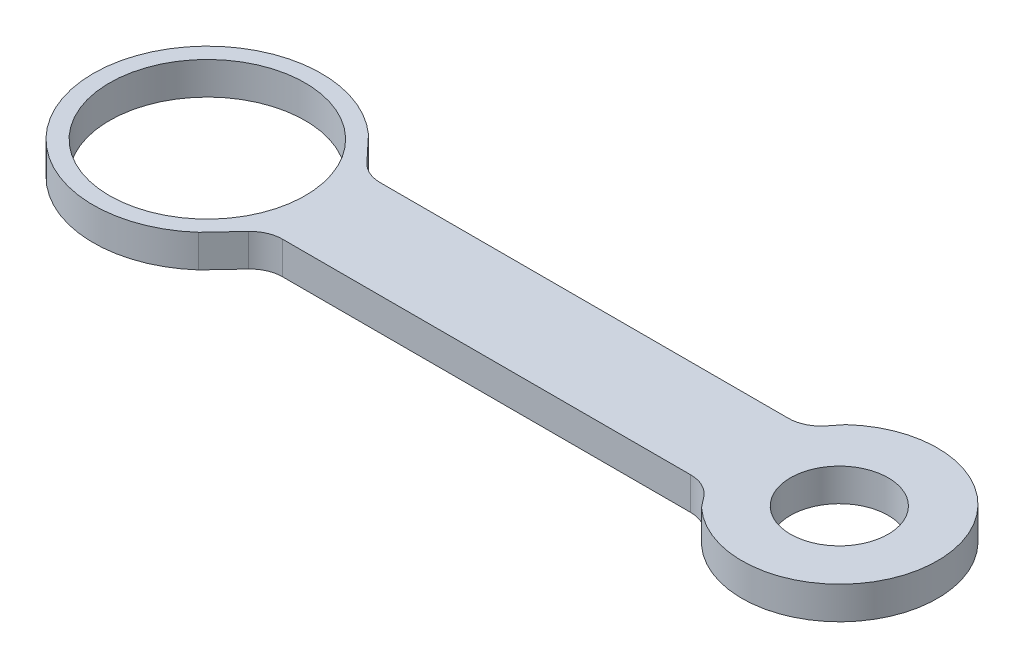
ISO-10303-21;
HEADER;
FILE_DESCRIPTION(('STEP AP214'),'2;1');
FILE_NAME('part.step','',(''),(''),'','','');
FILE_SCHEMA(('AUTOMOTIVE_DESIGN { 1 0 10303 214 1 1 1 1 }'));
ENDSEC;
DATA;
#1=APPLICATION_CONTEXT('core data for automotive mechanical design processes');
#2=APPLICATION_PROTOCOL_DEFINITION('international standard','automotive_design',2000,#1);
#3=PRODUCT_CONTEXT('',#1,'mechanical');
#4=PRODUCT('Part','Part','',(#3));
#5=PRODUCT_RELATED_PRODUCT_CATEGORY('part','',(#4));
#6=PRODUCT_DEFINITION_FORMATION('','',#4);
#7=PRODUCT_DEFINITION_CONTEXT('part definition',#1,'design');
#8=PRODUCT_DEFINITION('design','',#6,#7);
#9=PRODUCT_DEFINITION_SHAPE('','',#8);
#10=(LENGTH_UNIT() NAMED_UNIT(*) SI_UNIT(.MILLI.,.METRE.));
#11=(NAMED_UNIT(*) PLANE_ANGLE_UNIT() SI_UNIT($,.RADIAN.));
#12=(NAMED_UNIT(*) SI_UNIT($,.STERADIAN.) SOLID_ANGLE_UNIT());
#13=UNCERTAINTY_MEASURE_WITH_UNIT(LENGTH_MEASURE(1.E-05),#10,'distance_accuracy_value','');
#14=(GEOMETRIC_REPRESENTATION_CONTEXT(3) GLOBAL_UNCERTAINTY_ASSIGNED_CONTEXT((#13)) GLOBAL_UNIT_ASSIGNED_CONTEXT((#10,
#11,#12)) REPRESENTATION_CONTEXT('',''));
#15=CARTESIAN_POINT('',(0.,0.,0.));
#16=DIRECTION('',(0.,0.,1.));
#17=DIRECTION('',(1.,0.,0.));
#18=AXIS2_PLACEMENT_3D('',#15,#16,#17);
#19=CARTESIAN_POINT('',(34.5542588042572,10.,29.2896186462432));
#20=DIRECTION('',(0.,1.,0.));
#21=DIRECTION('',(0.,0.,1.));
#22=AXIS2_PLACEMENT_3D('',#19,#20,#21);
#23=PLANE('',#22);
#24=CARTESIAN_POINT('',(-128.685528506925,10.,4.28961864624316));
#25=DIRECTION('',(0.,1.,0.));
#26=DIRECTION('',(0.,0.,1.));
#27=AXIS2_PLACEMENT_3D('',#24,#25,#26);
#28=CIRCLE('',#27,30.);
#29=CARTESIAN_POINT('',(-128.685528506925,10.,34.2896186462432));
#30=VERTEX_POINT('',#29);
#31=EDGE_CURVE('E313',#30,#30,#28,.T.);
#32=ORIENTED_EDGE('',*,*,#31,.F.);
#33=EDGE_LOOP('',(#32));
#34=FACE_BOUND('',#33,.T.);
#35=CARTESIAN_POINT('',(65.6642007032262,10.,4.77304690580662));
#36=DIRECTION('',(0.,1.,0.));
#37=DIRECTION('',(0.,0.,1.));
#38=AXIS2_PLACEMENT_3D('',#35,#36,#37);
#39=CIRCLE('',#38,15.);
#40=CARTESIAN_POINT('',(65.6642007032262,10.,19.7730469058066));
#41=VERTEX_POINT('',#40);
#42=EDGE_CURVE('E321',#41,#41,#39,.T.);
#43=ORIENTED_EDGE('',*,*,#42,.F.);
#44=EDGE_LOOP('',(#43));
#45=FACE_BOUND('',#44,.T.);
#46=CARTESIAN_POINT('',(34.5542588042572,10.,29.2896186462432));
#47=DIRECTION('',(0.,-1.,0.));
#48=DIRECTION('',(0.,0.,1.));
#49=AXIS2_PLACEMENT_3D('',#46,#47,#48);
#50=CIRCLE('',#49,10.);
#51=CARTESIAN_POINT('',(34.5542588042572,10.,19.2896186462432));
#52=VERTEX_POINT('',#51);
#53=CARTESIAN_POINT('',(42.3953887831997,10.,23.0834378034599));
#54=VERTEX_POINT('',#53);
#55=EDGE_CURVE('E199',#52,#54,#50,.T.);
#56=ORIENTED_EDGE('',*,*,#55,.T.);
#57=DIRECTION('',(0.620618084278327,0.,0.784112997894244));
#58=VECTOR('',#57,1.);
#59=CARTESIAN_POINT('',(42.3953887831997,10.,23.0834378034599));
#60=LINE('',#59,#58);
#61=CARTESIAN_POINT('',(45.0141879093079,10.,26.3921303563741));
#62=VERTEX_POINT('',#61);
#63=EDGE_CURVE('E112',#54,#62,#60,.T.);
#64=ORIENTED_EDGE('',*,*,#63,.T.);
#65=CARTESIAN_POINT('',(65.2991324767334,10.,4.28961864624317));
#66=DIRECTION('',(0.,1.,0.));
#67=DIRECTION('',(0.,0.,1.));
#68=AXIS2_PLACEMENT_3D('',#65,#66,#67);
#69=CIRCLE('',#68,30.);
#70=CARTESIAN_POINT('',(45.0141879093079,10.,-17.8128930638877));
#71=VERTEX_POINT('',#70);
#72=EDGE_CURVE('E236',#62,#71,#69,.T.);
#73=ORIENTED_EDGE('',*,*,#72,.T.);
#74=DIRECTION('',(-0.620618084278327,0.,0.784112997894244));
#75=VECTOR('',#74,1.);
#76=CARTESIAN_POINT('',(42.3953887831997,10.,-14.5042005109736));
#77=LINE('',#76,#75);
#78=CARTESIAN_POINT('',(42.3953887831997,10.,-14.5042005109736));
#79=VERTEX_POINT('',#78);
#80=EDGE_CURVE('E255',#71,#79,#77,.T.);
#81=ORIENTED_EDGE('',*,*,#80,.T.);
#82=CARTESIAN_POINT('',(34.5542588042572,10.,-20.7103813537568));
#83=DIRECTION('',(0.,-1.,0.));
#84=DIRECTION('',(0.,0.,-1.));
#85=AXIS2_PLACEMENT_3D('',#82,#83,#84);
#86=CIRCLE('',#85,10.);
#87=CARTESIAN_POINT('',(34.5542588042572,10.,-10.7103813537568));
#88=VERTEX_POINT('',#87);
#89=EDGE_CURVE('E251',#79,#88,#86,.T.);
#90=ORIENTED_EDGE('',*,*,#89,.T.);
#91=DIRECTION('',(-1.,0.,0.));
#92=VECTOR('',#91,1.);
#93=CARTESIAN_POINT('',(-90.6073835006081,10.,-10.7103813537568));
#94=LINE('',#93,#92);
#95=CARTESIAN_POINT('',(-90.6073835006081,10.,-10.7103813537568));
#96=VERTEX_POINT('',#95);
#97=EDGE_CURVE('E254',#88,#96,#94,.T.);
#98=ORIENTED_EDGE('',*,*,#97,.T.);
#99=CARTESIAN_POINT('',(-90.6073835006081,10.,-20.7103813537568));
#100=DIRECTION('',(0.,-1.,0.));
#101=DIRECTION('',(0.,0.,-1.));
#102=AXIS2_PLACEMENT_3D('',#99,#100,#101);
#103=CIRCLE('',#102,10.);
#104=CARTESIAN_POINT('',(-97.8975448968442,10.,-13.8654162832229));
#105=VERTEX_POINT('',#104);
#106=EDGE_CURVE('E259',#96,#105,#103,.T.);
#107=ORIENTED_EDGE('',*,*,#106,.T.);
#108=DIRECTION('',(-0.684496507053392,0.,-0.729016139623606));
#109=VECTOR('',#108,1.);
#110=CARTESIAN_POINT('',(-97.8975448968442,10.,-13.8654162832229));
#111=LINE('',#110,#109);
#112=CARTESIAN_POINT('',(-105.31036862235,10.,-21.7603698445526));
#113=VERTEX_POINT('',#112);
#114=EDGE_CURVE('E266',#105,#113,#111,.T.);
#115=ORIENTED_EDGE('',*,*,#114,.T.);
#116=CARTESIAN_POINT('',(-128.685528506925,10.,4.28961864624316));
#117=DIRECTION('',(0.,1.,0.));
#118=DIRECTION('',(0.,0.,1.));
#119=AXIS2_PLACEMENT_3D('',#116,#117,#118);
#120=CIRCLE('',#119,35.);
#121=CARTESIAN_POINT('',(-105.31036862235,10.,30.3396071370389));
#122=VERTEX_POINT('',#121);
#123=EDGE_CURVE('E142',#113,#122,#120,.T.);
#124=ORIENTED_EDGE('',*,*,#123,.T.);
#125=DIRECTION('',(0.684496507053393,0.,-0.729016139623606));
#126=VECTOR('',#125,1.);
#127=CARTESIAN_POINT('',(-105.31036862235,10.,30.3396071370389));
#128=LINE('',#127,#126);
#129=CARTESIAN_POINT('',(-97.8975448968442,10.,22.4446535757093));
#130=VERTEX_POINT('',#129);
#131=EDGE_CURVE('E137',#122,#130,#128,.T.);
#132=ORIENTED_EDGE('',*,*,#131,.T.);
#133=CARTESIAN_POINT('',(-90.6073835006081,10.,29.2896186462432));
#134=DIRECTION('',(0.,-1.,0.));
#135=DIRECTION('',(0.,0.,1.));
#136=AXIS2_PLACEMENT_3D('',#133,#134,#135);
#137=CIRCLE('',#136,10.);
#138=CARTESIAN_POINT('',(-90.6073835006081,10.,19.2896186462432));
#139=VERTEX_POINT('',#138);
#140=EDGE_CURVE('E140',#130,#139,#137,.T.);
#141=ORIENTED_EDGE('',*,*,#140,.T.);
#142=DIRECTION('',(1.,0.,0.));
#143=VECTOR('',#142,1.);
#144=CARTESIAN_POINT('',(-90.6073835006081,10.,19.2896186462432));
#145=LINE('',#144,#143);
#146=EDGE_CURVE('E57',#139,#52,#145,.T.);
#147=ORIENTED_EDGE('',*,*,#146,.T.);
#148=EDGE_LOOP('',(#56,#64,#73,#81,#90,#98,#107,#115,#124,#132,#141,#147));
#149=FACE_BOUND('',#148,.T.);
#150=ADVANCED_FACE('F39',(#34,#45,#149),#23,.T.);
#151=CARTESIAN_POINT('',(34.5542588042572,0.,29.2896186462432));
#152=DIRECTION('',(0.,1.,0.));
#153=DIRECTION('',(0.,0.,1.));
#154=AXIS2_PLACEMENT_3D('',#151,#152,#153);
#155=PLANE('',#154);
#156=CARTESIAN_POINT('',(-128.685528506925,0.,4.28961864624316));
#157=DIRECTION('',(0.,1.,0.));
#158=DIRECTION('',(0.,0.,1.));
#159=AXIS2_PLACEMENT_3D('',#156,#157,#158);
#160=CIRCLE('',#159,30.);
#161=CARTESIAN_POINT('',(-128.685528506925,0.,34.2896186462432));
#162=VERTEX_POINT('',#161);
#163=EDGE_CURVE('E169',#162,#162,#160,.T.);
#164=ORIENTED_EDGE('',*,*,#163,.T.);
#165=EDGE_LOOP('',(#164));
#166=FACE_BOUND('',#165,.T.);
#167=CARTESIAN_POINT('',(65.6642007032262,0.,4.77304690580662));
#168=DIRECTION('',(0.,1.,0.));
#169=DIRECTION('',(0.,0.,1.));
#170=AXIS2_PLACEMENT_3D('',#167,#168,#169);
#171=CIRCLE('',#170,15.);
#172=CARTESIAN_POINT('',(65.6642007032262,0.,19.7730469058066));
#173=VERTEX_POINT('',#172);
#174=EDGE_CURVE('E315',#173,#173,#171,.T.);
#175=ORIENTED_EDGE('',*,*,#174,.T.);
#176=EDGE_LOOP('',(#175));
#177=FACE_BOUND('',#176,.T.);
#178=CARTESIAN_POINT('',(34.5542588042572,0.,29.2896186462432));
#179=DIRECTION('',(0.,-1.,0.));
#180=DIRECTION('',(0.,0.,1.));
#181=AXIS2_PLACEMENT_3D('',#178,#179,#180);
#182=CIRCLE('',#181,10.);
#183=CARTESIAN_POINT('',(34.5542588042572,0.,19.2896186462432));
#184=VERTEX_POINT('',#183);
#185=CARTESIAN_POINT('',(42.3953887831997,0.,23.0834378034599));
#186=VERTEX_POINT('',#185);
#187=EDGE_CURVE('E164',#184,#186,#182,.T.);
#188=ORIENTED_EDGE('',*,*,#187,.F.);
#189=DIRECTION('',(1.,0.,0.));
#190=VECTOR('',#189,1.);
#191=CARTESIAN_POINT('',(-90.6073835006081,0.,19.2896186462432));
#192=LINE('',#191,#190);
#193=CARTESIAN_POINT('',(-90.6073835006081,0.,19.2896186462432));
#194=VERTEX_POINT('',#193);
#195=EDGE_CURVE('E104',#194,#184,#192,.T.);
#196=ORIENTED_EDGE('',*,*,#195,.F.);
#197=CARTESIAN_POINT('',(-90.6073835006081,0.,29.2896186462432));
#198=DIRECTION('',(0.,-1.,0.));
#199=DIRECTION('',(0.,0.,1.));
#200=AXIS2_PLACEMENT_3D('',#197,#198,#199);
#201=CIRCLE('',#200,10.);
#202=CARTESIAN_POINT('',(-97.8975448968442,0.,22.4446535757093));
#203=VERTEX_POINT('',#202);
#204=EDGE_CURVE('E98',#203,#194,#201,.T.);
#205=ORIENTED_EDGE('',*,*,#204,.F.);
#206=DIRECTION('',(0.684496507053393,0.,-0.729016139623606));
#207=VECTOR('',#206,1.);
#208=CARTESIAN_POINT('',(-105.31036862235,0.,30.3396071370389));
#209=LINE('',#208,#207);
#210=CARTESIAN_POINT('',(-105.31036862235,0.,30.3396071370389));
#211=VERTEX_POINT('',#210);
#212=EDGE_CURVE('E151',#211,#203,#209,.T.);
#213=ORIENTED_EDGE('',*,*,#212,.F.);
#214=CARTESIAN_POINT('',(-128.685528506925,0.,4.28961864624316));
#215=DIRECTION('',(0.,1.,0.));
#216=DIRECTION('',(0.,0.,1.));
#217=AXIS2_PLACEMENT_3D('',#214,#215,#216);
#218=CIRCLE('',#217,35.);
#219=CARTESIAN_POINT('',(-105.31036862235,0.,-21.7603698445526));
#220=VERTEX_POINT('',#219);
#221=EDGE_CURVE('E190',#220,#211,#218,.T.);
#222=ORIENTED_EDGE('',*,*,#221,.F.);
#223=DIRECTION('',(-0.684496507053392,0.,-0.729016139623606));
#224=VECTOR('',#223,1.);
#225=CARTESIAN_POINT('',(-97.8975448968442,0.,-13.8654162832229));
#226=LINE('',#225,#224);
#227=CARTESIAN_POINT('',(-97.8975448968442,0.,-13.8654162832229));
#228=VERTEX_POINT('',#227);
#229=EDGE_CURVE('E187',#228,#220,#226,.T.);
#230=ORIENTED_EDGE('',*,*,#229,.F.);
#231=CARTESIAN_POINT('',(-90.6073835006081,0.,-20.7103813537568));
#232=DIRECTION('',(0.,-1.,0.));
#233=DIRECTION('',(0.,0.,-1.));
#234=AXIS2_PLACEMENT_3D('',#231,#232,#233);
#235=CIRCLE('',#234,10.);
#236=CARTESIAN_POINT('',(-90.6073835006081,0.,-10.7103813537568));
#237=VERTEX_POINT('',#236);
#238=EDGE_CURVE('E184',#237,#228,#235,.T.);
#239=ORIENTED_EDGE('',*,*,#238,.F.);
#240=DIRECTION('',(-1.,0.,0.));
#241=VECTOR('',#240,1.);
#242=CARTESIAN_POINT('',(-90.6073835006081,0.,-10.7103813537568));
#243=LINE('',#242,#241);
#244=CARTESIAN_POINT('',(34.5542588042572,0.,-10.7103813537568));
#245=VERTEX_POINT('',#244);
#246=EDGE_CURVE('E181',#245,#237,#243,.T.);
#247=ORIENTED_EDGE('',*,*,#246,.F.);
#248=CARTESIAN_POINT('',(34.5542588042572,0.,-20.7103813537568));
#249=DIRECTION('',(0.,-1.,0.));
#250=DIRECTION('',(0.,0.,-1.));
#251=AXIS2_PLACEMENT_3D('',#248,#249,#250);
#252=CIRCLE('',#251,10.);
#253=CARTESIAN_POINT('',(42.3953887831997,0.,-14.5042005109736));
#254=VERTEX_POINT('',#253);
#255=EDGE_CURVE('E178',#254,#245,#252,.T.);
#256=ORIENTED_EDGE('',*,*,#255,.F.);
#257=DIRECTION('',(-0.620618084278327,0.,0.784112997894244));
#258=VECTOR('',#257,1.);
#259=CARTESIAN_POINT('',(42.3953887831997,0.,-14.5042005109736));
#260=LINE('',#259,#258);
#261=CARTESIAN_POINT('',(45.0141879093079,0.,-17.8128930638877));
#262=VERTEX_POINT('',#261);
#263=EDGE_CURVE('E175',#262,#254,#260,.T.);
#264=ORIENTED_EDGE('',*,*,#263,.F.);
#265=CARTESIAN_POINT('',(65.2991324767334,0.,4.28961864624317));
#266=DIRECTION('',(0.,1.,0.));
#267=DIRECTION('',(0.,0.,1.));
#268=AXIS2_PLACEMENT_3D('',#265,#266,#267);
#269=CIRCLE('',#268,30.);
#270=CARTESIAN_POINT('',(45.0141879093079,0.,26.3921303563741));
#271=VERTEX_POINT('',#270);
#272=EDGE_CURVE('E172',#271,#262,#269,.T.);
#273=ORIENTED_EDGE('',*,*,#272,.F.);
#274=DIRECTION('',(0.620618084278327,0.,0.784112997894244));
#275=VECTOR('',#274,1.);
#276=CARTESIAN_POINT('',(42.3953887831997,0.,23.0834378034599));
#277=LINE('',#276,#275);
#278=EDGE_CURVE('E168',#186,#271,#277,.T.);
#279=ORIENTED_EDGE('',*,*,#278,.F.);
#280=EDGE_LOOP('',(#188,#196,#205,#213,#222,#230,#239,#247,#256,#264,#273,#279));
#281=FACE_BOUND('',#280,.T.);
#282=ADVANCED_FACE('F240',(#166,#177,#281),#155,.F.);
#283=CARTESIAN_POINT('',(34.5542588042572,10.,29.2896186462432));
#284=DIRECTION('',(0.,-1.,0.));
#285=DIRECTION('',(0.,0.,-1.));
#286=AXIS2_PLACEMENT_3D('',#283,#284,#285);
#287=CYLINDRICAL_SURFACE('',#286,10.);
#288=ORIENTED_EDGE('',*,*,#187,.T.);
#289=DIRECTION('',(0.,-1.,0.));
#290=VECTOR('',#289,1.);
#291=CARTESIAN_POINT('',(42.3953887831997,10.,23.0834378034599));
#292=LINE('',#291,#290);
#293=EDGE_CURVE('E11',#54,#186,#292,.T.);
#294=ORIENTED_EDGE('',*,*,#293,.F.);
#295=ORIENTED_EDGE('',*,*,#55,.F.);
#296=DIRECTION('',(0.,-1.,0.));
#297=VECTOR('',#296,1.);
#298=CARTESIAN_POINT('',(34.5542588042572,10.,19.2896186462432));
#299=LINE('',#298,#297);
#300=EDGE_CURVE('E160',#52,#184,#299,.T.);
#301=ORIENTED_EDGE('',*,*,#300,.T.);
#302=EDGE_LOOP('',(#288,#294,#295,#301));
#303=FACE_BOUND('',#302,.T.);
#304=ADVANCED_FACE('F41',(#303),#287,.F.);
#305=CARTESIAN_POINT('',(42.3953887831997,10.,23.0834378034599));
#306=DIRECTION('',(0.784112997894244,0.,-0.620618084278327));
#307=DIRECTION('',(-0.620618084278327,0.,-0.784112997894244));
#308=AXIS2_PLACEMENT_3D('',#305,#306,#307);
#309=PLANE('',#308);
#310=ORIENTED_EDGE('',*,*,#278,.T.);
#311=DIRECTION('',(0.,-1.,0.));
#312=VECTOR('',#311,1.);
#313=CARTESIAN_POINT('',(45.0141879093079,10.,26.3921303563741));
#314=LINE('',#313,#312);
#315=EDGE_CURVE('E49',#62,#271,#314,.T.);
#316=ORIENTED_EDGE('',*,*,#315,.F.);
#317=ORIENTED_EDGE('',*,*,#63,.F.);
#318=ORIENTED_EDGE('',*,*,#293,.T.);
#319=EDGE_LOOP('',(#310,#316,#317,#318));
#320=FACE_BOUND('',#319,.T.);
#321=ADVANCED_FACE('F430',(#320),#309,.F.);
#322=CARTESIAN_POINT('',(65.2991324767334,10.,4.28961864624317));
#323=DIRECTION('',(0.,-1.,0.));
#324=DIRECTION('',(0.,0.,-1.));
#325=AXIS2_PLACEMENT_3D('',#322,#323,#324);
#326=CYLINDRICAL_SURFACE('',#325,30.);
#327=ORIENTED_EDGE('',*,*,#272,.T.);
#328=DIRECTION('',(0.,-1.,0.));
#329=VECTOR('',#328,1.);
#330=CARTESIAN_POINT('',(45.0141879093079,10.,-17.8128930638877));
#331=LINE('',#330,#329);
#332=EDGE_CURVE('E226',#71,#262,#331,.T.);
#333=ORIENTED_EDGE('',*,*,#332,.F.);
#334=ORIENTED_EDGE('',*,*,#72,.F.);
#335=ORIENTED_EDGE('',*,*,#315,.T.);
#336=EDGE_LOOP('',(#327,#333,#334,#335));
#337=FACE_BOUND('',#336,.T.);
#338=ADVANCED_FACE('F234',(#337),#326,.T.);
#339=CARTESIAN_POINT('',(42.3953887831997,10.,-14.5042005109736));
#340=DIRECTION('',(0.784112997894244,0.,0.620618084278327));
#341=DIRECTION('',(0.620618084278327,0.,-0.784112997894244));
#342=AXIS2_PLACEMENT_3D('',#339,#340,#341);
#343=PLANE('',#342);
#344=ORIENTED_EDGE('',*,*,#263,.T.);
#345=DIRECTION('',(0.,-1.,0.));
#346=VECTOR('',#345,1.);
#347=CARTESIAN_POINT('',(42.3953887831997,10.,-14.5042005109736));
#348=LINE('',#347,#346);
#349=EDGE_CURVE('E222',#79,#254,#348,.T.);
#350=ORIENTED_EDGE('',*,*,#349,.F.);
#351=ORIENTED_EDGE('',*,*,#80,.F.);
#352=ORIENTED_EDGE('',*,*,#332,.T.);
#353=EDGE_LOOP('',(#344,#350,#351,#352));
#354=FACE_BOUND('',#353,.T.);
#355=ADVANCED_FACE('F245',(#354),#343,.F.);
#356=CARTESIAN_POINT('',(34.5542588042572,10.,-20.7103813537568));
#357=DIRECTION('',(0.,-1.,0.));
#358=DIRECTION('',(0.,0.,-1.));
#359=AXIS2_PLACEMENT_3D('',#356,#357,#358);
#360=CYLINDRICAL_SURFACE('',#359,10.);
#361=ORIENTED_EDGE('',*,*,#255,.T.);
#362=DIRECTION('',(0.,-1.,0.));
#363=VECTOR('',#362,1.);
#364=CARTESIAN_POINT('',(34.5542588042572,10.,-10.7103813537568));
#365=LINE('',#364,#363);
#366=EDGE_CURVE('E218',#88,#245,#365,.T.);
#367=ORIENTED_EDGE('',*,*,#366,.F.);
#368=ORIENTED_EDGE('',*,*,#89,.F.);
#369=ORIENTED_EDGE('',*,*,#349,.T.);
#370=EDGE_LOOP('',(#361,#367,#368,#369));
#371=FACE_BOUND('',#370,.T.);
#372=ADVANCED_FACE('F249',(#371),#360,.F.);
#373=CARTESIAN_POINT('',(-90.6073835006081,10.,-10.7103813537568));
#374=DIRECTION('',(0.,0.,1.));
#375=DIRECTION('',(1.,0.,0.));
#376=AXIS2_PLACEMENT_3D('',#373,#374,#375);
#377=PLANE('',#376);
#378=ORIENTED_EDGE('',*,*,#246,.T.);
#379=DIRECTION('',(0.,-1.,0.));
#380=VECTOR('',#379,1.);
#381=CARTESIAN_POINT('',(-90.6073835006081,10.,-10.7103813537568));
#382=LINE('',#381,#380);
#383=EDGE_CURVE('E214',#96,#237,#382,.T.);
#384=ORIENTED_EDGE('',*,*,#383,.F.);
#385=ORIENTED_EDGE('',*,*,#97,.F.);
#386=ORIENTED_EDGE('',*,*,#366,.T.);
#387=EDGE_LOOP('',(#378,#384,#385,#386));
#388=FACE_BOUND('',#387,.T.);
#389=ADVANCED_FACE('F395',(#388),#377,.F.);
#390=CARTESIAN_POINT('',(-90.6073835006081,10.,-20.7103813537568));
#391=DIRECTION('',(0.,-1.,0.));
#392=DIRECTION('',(0.,0.,-1.));
#393=AXIS2_PLACEMENT_3D('',#390,#391,#392);
#394=CYLINDRICAL_SURFACE('',#393,10.);
#395=ORIENTED_EDGE('',*,*,#238,.T.);
#396=DIRECTION('',(0.,-1.,0.));
#397=VECTOR('',#396,1.);
#398=CARTESIAN_POINT('',(-97.8975448968442,10.,-13.8654162832229));
#399=LINE('',#398,#397);
#400=EDGE_CURVE('E210',#105,#228,#399,.T.);
#401=ORIENTED_EDGE('',*,*,#400,.F.);
#402=ORIENTED_EDGE('',*,*,#106,.F.);
#403=ORIENTED_EDGE('',*,*,#383,.T.);
#404=EDGE_LOOP('',(#395,#401,#402,#403));
#405=FACE_BOUND('',#404,.T.);
#406=ADVANCED_FACE('F386',(#405),#394,.F.);
#407=CARTESIAN_POINT('',(-97.8975448968442,10.,-13.8654162832229));
#408=DIRECTION('',(-0.729016139623606,0.,0.684496507053392));
#409=DIRECTION('',(0.684496507053392,0.,0.729016139623606));
#410=AXIS2_PLACEMENT_3D('',#407,#408,#409);
#411=PLANE('',#410);
#412=ORIENTED_EDGE('',*,*,#229,.T.);
#413=DIRECTION('',(0.,-1.,0.));
#414=VECTOR('',#413,1.);
#415=CARTESIAN_POINT('',(-105.31036862235,10.,-21.7603698445526));
#416=LINE('',#415,#414);
#417=EDGE_CURVE('E206',#113,#220,#416,.T.);
#418=ORIENTED_EDGE('',*,*,#417,.F.);
#419=ORIENTED_EDGE('',*,*,#114,.F.);
#420=ORIENTED_EDGE('',*,*,#400,.T.);
#421=EDGE_LOOP('',(#412,#418,#419,#420));
#422=FACE_BOUND('',#421,.T.);
#423=ADVANCED_FACE('F274',(#422),#411,.F.);
#424=CARTESIAN_POINT('',(-128.685528506925,10.,4.28961864624316));
#425=DIRECTION('',(0.,-1.,0.));
#426=DIRECTION('',(0.,0.,-1.));
#427=AXIS2_PLACEMENT_3D('',#424,#425,#426);
#428=CYLINDRICAL_SURFACE('',#427,35.);
#429=ORIENTED_EDGE('',*,*,#221,.T.);
#430=DIRECTION('',(0.,-1.,0.));
#431=VECTOR('',#430,1.);
#432=CARTESIAN_POINT('',(-105.31036862235,10.,30.3396071370389));
#433=LINE('',#432,#431);
#434=EDGE_CURVE('E153',#122,#211,#433,.T.);
#435=ORIENTED_EDGE('',*,*,#434,.F.);
#436=ORIENTED_EDGE('',*,*,#123,.F.);
#437=ORIENTED_EDGE('',*,*,#417,.T.);
#438=EDGE_LOOP('',(#429,#435,#436,#437));
#439=FACE_BOUND('',#438,.T.);
#440=ADVANCED_FACE('F278',(#439),#428,.T.);
#441=CARTESIAN_POINT('',(-105.31036862235,10.,30.3396071370389));
#442=DIRECTION('',(-0.729016139623606,0.,-0.684496507053393));
#443=DIRECTION('',(-0.684496507053393,0.,0.729016139623606));
#444=AXIS2_PLACEMENT_3D('',#441,#442,#443);
#445=PLANE('',#444);
#446=ORIENTED_EDGE('',*,*,#212,.T.);
#447=DIRECTION('',(0.,-1.,0.));
#448=VECTOR('',#447,1.);
#449=CARTESIAN_POINT('',(-97.8975448968442,10.,22.4446535757093));
#450=LINE('',#449,#448);
#451=EDGE_CURVE('E148',#130,#203,#450,.T.);
#452=ORIENTED_EDGE('',*,*,#451,.F.);
#453=ORIENTED_EDGE('',*,*,#131,.F.);
#454=ORIENTED_EDGE('',*,*,#434,.T.);
#455=EDGE_LOOP('',(#446,#452,#453,#454));
#456=FACE_BOUND('',#455,.T.);
#457=ADVANCED_FACE('F149',(#456),#445,.F.);
#458=CARTESIAN_POINT('',(-90.6073835006081,10.,29.2896186462432));
#459=DIRECTION('',(0.,-1.,0.));
#460=DIRECTION('',(0.,0.,-1.));
#461=AXIS2_PLACEMENT_3D('',#458,#459,#460);
#462=CYLINDRICAL_SURFACE('',#461,10.);
#463=ORIENTED_EDGE('',*,*,#204,.T.);
#464=DIRECTION('',(0.,-1.,0.));
#465=VECTOR('',#464,1.);
#466=CARTESIAN_POINT('',(-90.6073835006081,10.,19.2896186462432));
#467=LINE('',#466,#465);
#468=EDGE_CURVE('E154',#139,#194,#467,.T.);
#469=ORIENTED_EDGE('',*,*,#468,.F.);
#470=ORIENTED_EDGE('',*,*,#140,.F.);
#471=ORIENTED_EDGE('',*,*,#451,.T.);
#472=EDGE_LOOP('',(#463,#469,#470,#471));
#473=FACE_BOUND('',#472,.T.);
#474=ADVANCED_FACE('F156',(#473),#462,.F.);
#475=CARTESIAN_POINT('',(-90.6073835006081,10.,19.2896186462432));
#476=DIRECTION('',(0.,0.,-1.));
#477=DIRECTION('',(-1.,0.,0.));
#478=AXIS2_PLACEMENT_3D('',#475,#476,#477);
#479=PLANE('',#478);
#480=ORIENTED_EDGE('',*,*,#195,.T.);
#481=ORIENTED_EDGE('',*,*,#300,.F.);
#482=ORIENTED_EDGE('',*,*,#146,.F.);
#483=ORIENTED_EDGE('',*,*,#468,.T.);
#484=EDGE_LOOP('',(#480,#481,#482,#483));
#485=FACE_BOUND('',#484,.T.);
#486=ADVANCED_FACE('F282',(#485),#479,.F.);
#487=CARTESIAN_POINT('',(65.6642007032262,0.,4.77304690580662));
#488=DIRECTION('',(0.,1.,0.));
#489=DIRECTION('',(0.,0.,1.));
#490=AXIS2_PLACEMENT_3D('',#487,#488,#489);
#491=CYLINDRICAL_SURFACE('',#490,15.);
#492=ORIENTED_EDGE('',*,*,#174,.F.);
#493=EDGE_LOOP('',(#492));
#494=FACE_BOUND('',#493,.T.);
#495=ORIENTED_EDGE('',*,*,#42,.T.);
#496=EDGE_LOOP('',(#495));
#497=FACE_BOUND('',#496,.T.);
#498=ADVANCED_FACE('F284',(#494,#497),#491,.F.);
#499=CARTESIAN_POINT('',(-128.685528506925,0.,4.28961864624316));
#500=DIRECTION('',(0.,1.,0.));
#501=DIRECTION('',(0.,0.,1.));
#502=AXIS2_PLACEMENT_3D('',#499,#500,#501);
#503=CYLINDRICAL_SURFACE('',#502,30.);
#504=ORIENTED_EDGE('',*,*,#163,.F.);
#505=EDGE_LOOP('',(#504));
#506=FACE_BOUND('',#505,.T.);
#507=ORIENTED_EDGE('',*,*,#31,.T.);
#508=EDGE_LOOP('',(#507));
#509=FACE_BOUND('',#508,.T.);
#510=ADVANCED_FACE('F290',(#506,#509),#503,.F.);
#511=CLOSED_SHELL('',(#150,#282,#304,#321,#338,#355,#372,#389,#406,#423,#440,#457,#474,#486,
#498,#510));
#512=MANIFOLD_SOLID_BREP('B2',#511);
#513=ADVANCED_BREP_SHAPE_REPRESENTATION('',(#18,#512),#14);
#514=SHAPE_DEFINITION_REPRESENTATION(#9,#513);
ENDSEC;
END-ISO-10303-21;
